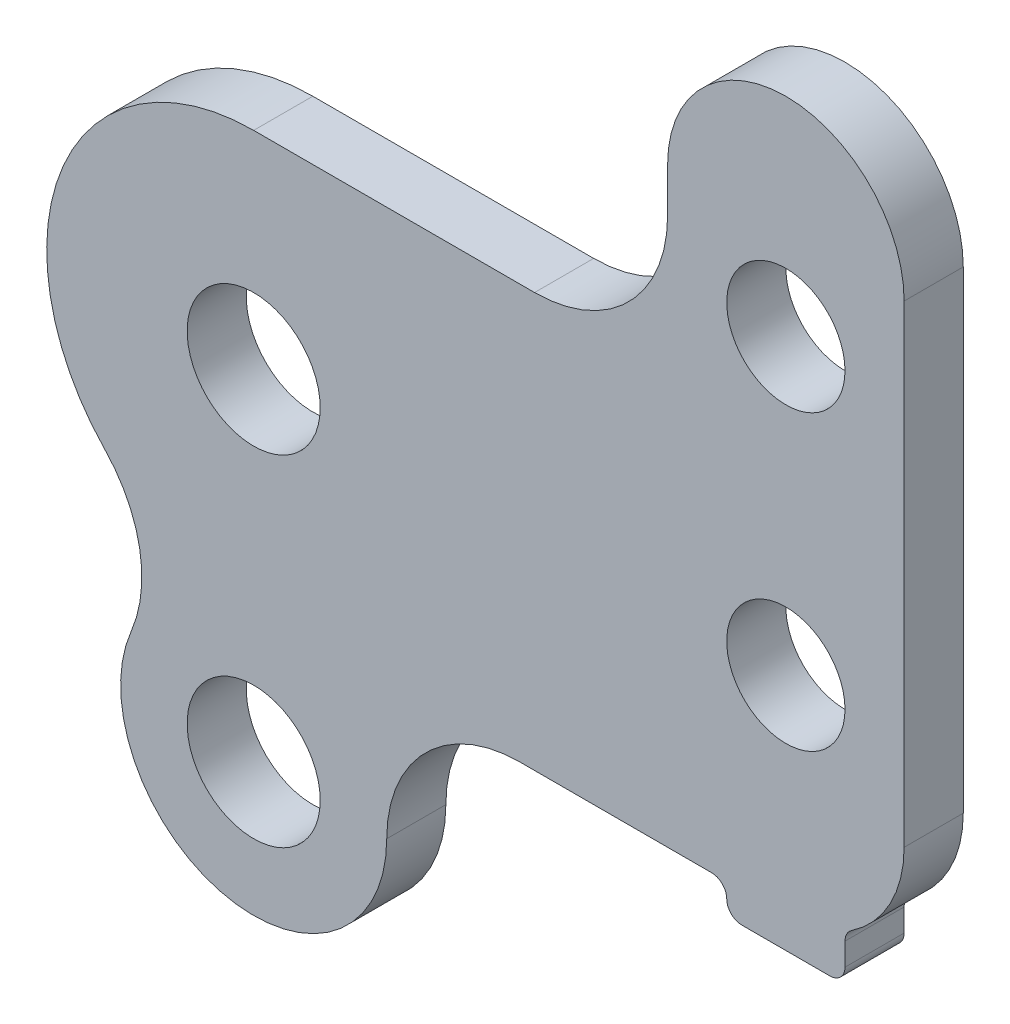
ISO-10303-21;
HEADER;
FILE_DESCRIPTION(('STEP AP214'),'2;1');
FILE_NAME('part.step','',(''),(''),'','','');
FILE_SCHEMA(('AUTOMOTIVE_DESIGN { 1 0 10303 214 1 1 1 1 }'));
ENDSEC;
DATA;
#1=APPLICATION_CONTEXT('core data for automotive mechanical design processes');
#2=APPLICATION_PROTOCOL_DEFINITION('international standard','automotive_design',2000,#1);
#3=PRODUCT_CONTEXT('',#1,'mechanical');
#4=PRODUCT('Part','Part','',(#3));
#5=PRODUCT_RELATED_PRODUCT_CATEGORY('part','',(#4));
#6=PRODUCT_DEFINITION_FORMATION('','',#4);
#7=PRODUCT_DEFINITION_CONTEXT('part definition',#1,'design');
#8=PRODUCT_DEFINITION('design','',#6,#7);
#9=PRODUCT_DEFINITION_SHAPE('','',#8);
#10=(LENGTH_UNIT() NAMED_UNIT(*) SI_UNIT(.MILLI.,.METRE.));
#11=(NAMED_UNIT(*) PLANE_ANGLE_UNIT() SI_UNIT($,.RADIAN.));
#12=(NAMED_UNIT(*) SI_UNIT($,.STERADIAN.) SOLID_ANGLE_UNIT());
#13=UNCERTAINTY_MEASURE_WITH_UNIT(LENGTH_MEASURE(1.E-05),#10,'distance_accuracy_value','');
#14=(GEOMETRIC_REPRESENTATION_CONTEXT(3) GLOBAL_UNCERTAINTY_ASSIGNED_CONTEXT((#13)) GLOBAL_UNIT_ASSIGNED_CONTEXT((#10,
#11,#12)) REPRESENTATION_CONTEXT('',''));
#15=CARTESIAN_POINT('',(0.,0.,0.));
#16=DIRECTION('',(0.,0.,1.));
#17=DIRECTION('',(1.,0.,0.));
#18=AXIS2_PLACEMENT_3D('',#15,#16,#17);
#19=CARTESIAN_POINT('',(0.,-6.36905,1.5875));
#20=DIRECTION('',(0.,1.,0.));
#21=DIRECTION('',(0.,0.,1.));
#22=AXIS2_PLACEMENT_3D('',#19,#20,#21);
#23=PLANE('',#22);
#24=DIRECTION('',(1.,0.,0.));
#25=VECTOR('',#24,1.);
#26=CARTESIAN_POINT('',(0.,-6.36905,0.));
#27=LINE('',#26,#25);
#28=CARTESIAN_POINT('',(13.1063647221787,-6.36905,0.));
#29=VERTEX_POINT('',#28);
#30=CARTESIAN_POINT('',(15.4685647221787,-6.36905,0.));
#31=VERTEX_POINT('',#30);
#32=EDGE_CURVE('E297',#29,#31,#27,.T.);
#33=ORIENTED_EDGE('',*,*,#32,.T.);
#34=DIRECTION('',(0.,0.,-1.));
#35=VECTOR('',#34,1.);
#36=CARTESIAN_POINT('',(15.4685647221787,-6.36905,1.5875));
#37=LINE('',#36,#35);
#38=CARTESIAN_POINT('',(15.4685647221787,-6.36905,1.5875));
#39=VERTEX_POINT('',#38);
#40=EDGE_CURVE('E338',#31,#39,#37,.F.);
#41=ORIENTED_EDGE('',*,*,#40,.T.);
#42=DIRECTION('',(1.,0.,0.));
#43=VECTOR('',#42,1.);
#44=CARTESIAN_POINT('',(0.,-6.36905,1.5875));
#45=LINE('',#44,#43);
#46=CARTESIAN_POINT('',(13.1063647221787,-6.36905,1.5875));
#47=VERTEX_POINT('',#46);
#48=EDGE_CURVE('E255',#47,#39,#45,.T.);
#49=ORIENTED_EDGE('',*,*,#48,.F.);
#50=DIRECTION('',(0.,0.,-1.));
#51=VECTOR('',#50,1.);
#52=CARTESIAN_POINT('',(13.1063647221787,-6.36905,1.5875));
#53=LINE('',#52,#51);
#54=EDGE_CURVE('E336',#47,#29,#53,.T.);
#55=ORIENTED_EDGE('',*,*,#54,.T.);
#56=EDGE_LOOP('',(#33,#41,#49,#55));
#57=FACE_BOUND('',#56,.T.);
#58=ADVANCED_FACE('F86',(#57),#23,.F.);
#59=CARTESIAN_POINT('',(0.,-9.128125,1.5875));
#60=DIRECTION('',(0.,0.,-1.));
#61=DIRECTION('',(-1.,0.,0.));
#62=AXIS2_PLACEMENT_3D('',#59,#60,#61);
#63=CYLINDRICAL_SURFACE('',#62,1.7859375);
#64=CARTESIAN_POINT('',(0.,-9.128125,1.5875));
#65=DIRECTION('',(0.,0.,1.));
#66=DIRECTION('',(1.,0.,0.));
#67=AXIS2_PLACEMENT_3D('',#64,#65,#66);
#68=CIRCLE('',#67,1.7859375);
#69=CARTESIAN_POINT('',(1.7859375,-9.128125,1.5875));
#70=VERTEX_POINT('',#69);
#71=EDGE_CURVE('E266',#70,#70,#68,.T.);
#72=ORIENTED_EDGE('',*,*,#71,.T.);
#73=EDGE_LOOP('',(#72));
#74=FACE_BOUND('',#73,.T.);
#75=CARTESIAN_POINT('',(0.,-9.128125,0.));
#76=DIRECTION('',(0.,0.,1.));
#77=DIRECTION('',(1.,0.,0.));
#78=AXIS2_PLACEMENT_3D('',#75,#76,#77);
#79=CIRCLE('',#78,1.7859375);
#80=CARTESIAN_POINT('',(1.7859375,-9.128125,0.));
#81=VERTEX_POINT('',#80);
#82=EDGE_CURVE('E309',#81,#81,#79,.T.);
#83=ORIENTED_EDGE('',*,*,#82,.F.);
#84=EDGE_LOOP('',(#83));
#85=FACE_BOUND('',#84,.T.);
#86=ADVANCED_FACE('F384',(#74,#85),#63,.F.);
#87=CARTESIAN_POINT('',(0.,0.,1.5875));
#88=DIRECTION('',(0.,0.,-1.));
#89=DIRECTION('',(-1.,0.,0.));
#90=AXIS2_PLACEMENT_3D('',#87,#88,#89);
#91=CYLINDRICAL_SURFACE('',#90,1.7859375);
#92=CARTESIAN_POINT('',(0.,0.,1.5875));
#93=DIRECTION('',(0.,0.,1.));
#94=DIRECTION('',(1.,0.,0.));
#95=AXIS2_PLACEMENT_3D('',#92,#93,#94);
#96=CIRCLE('',#95,1.7859375);
#97=CARTESIAN_POINT('',(1.7859375,0.,1.5875));
#98=VERTEX_POINT('',#97);
#99=EDGE_CURVE('E263',#98,#98,#96,.T.);
#100=ORIENTED_EDGE('',*,*,#99,.T.);
#101=EDGE_LOOP('',(#100));
#102=FACE_BOUND('',#101,.T.);
#103=CARTESIAN_POINT('',(0.,0.,0.));
#104=DIRECTION('',(0.,0.,1.));
#105=DIRECTION('',(1.,0.,0.));
#106=AXIS2_PLACEMENT_3D('',#103,#104,#105);
#107=CIRCLE('',#106,1.7859375);
#108=CARTESIAN_POINT('',(1.7859375,0.,0.));
#109=VERTEX_POINT('',#108);
#110=EDGE_CURVE('E306',#109,#109,#107,.T.);
#111=ORIENTED_EDGE('',*,*,#110,.F.);
#112=EDGE_LOOP('',(#111));
#113=FACE_BOUND('',#112,.T.);
#114=ADVANCED_FACE('F386',(#102,#113),#91,.F.);
#115=CARTESIAN_POINT('',(14.2874647221787,7.90575,1.5875));
#116=DIRECTION('',(0.,0.,-1.));
#117=DIRECTION('',(-1.,0.,0.));
#118=AXIS2_PLACEMENT_3D('',#115,#116,#117);
#119=CYLINDRICAL_SURFACE('',#118,1.58750000000001);
#120=CARTESIAN_POINT('',(14.2874647221787,7.90575,1.5875));
#121=DIRECTION('',(0.,0.,1.));
#122=DIRECTION('',(1.,0.,0.));
#123=AXIS2_PLACEMENT_3D('',#120,#121,#122);
#124=CIRCLE('',#123,1.58750000000001);
#125=CARTESIAN_POINT('',(15.8749647221787,7.90575,1.5875));
#126=VERTEX_POINT('',#125);
#127=EDGE_CURVE('E260',#126,#126,#124,.T.);
#128=ORIENTED_EDGE('',*,*,#127,.T.);
#129=EDGE_LOOP('',(#128));
#130=FACE_BOUND('',#129,.T.);
#131=CARTESIAN_POINT('',(14.2874647221787,7.90575,0.));
#132=DIRECTION('',(0.,0.,1.));
#133=DIRECTION('',(1.,0.,0.));
#134=AXIS2_PLACEMENT_3D('',#131,#132,#133);
#135=CIRCLE('',#134,1.58750000000001);
#136=CARTESIAN_POINT('',(15.8749647221787,7.90575,0.));
#137=VERTEX_POINT('',#136);
#138=EDGE_CURVE('E303',#137,#137,#135,.T.);
#139=ORIENTED_EDGE('',*,*,#138,.F.);
#140=EDGE_LOOP('',(#139));
#141=FACE_BOUND('',#140,.T.);
#142=ADVANCED_FACE('F393',(#130,#141),#119,.F.);
#143=CARTESIAN_POINT('',(14.2874647221787,0.0317500000000005,1.5875));
#144=DIRECTION('',(0.,0.,-1.));
#145=DIRECTION('',(-1.,0.,0.));
#146=AXIS2_PLACEMENT_3D('',#143,#144,#145);
#147=CYLINDRICAL_SURFACE('',#146,1.58750000000001);
#148=CARTESIAN_POINT('',(14.2874647221787,0.0317500000000005,1.5875));
#149=DIRECTION('',(0.,0.,1.));
#150=DIRECTION('',(1.,0.,0.));
#151=AXIS2_PLACEMENT_3D('',#148,#149,#150);
#152=CIRCLE('',#151,1.58750000000001);
#153=CARTESIAN_POINT('',(15.8749647221787,0.0317500000000005,1.5875));
#154=VERTEX_POINT('',#153);
#155=EDGE_CURVE('E257',#154,#154,#152,.T.);
#156=ORIENTED_EDGE('',*,*,#155,.T.);
#157=EDGE_LOOP('',(#156));
#158=FACE_BOUND('',#157,.T.);
#159=CARTESIAN_POINT('',(14.2874647221787,0.0317500000000005,0.));
#160=DIRECTION('',(0.,0.,1.));
#161=DIRECTION('',(1.,0.,0.));
#162=AXIS2_PLACEMENT_3D('',#159,#160,#161);
#163=CIRCLE('',#162,1.58750000000001);
#164=CARTESIAN_POINT('',(15.8749647221787,0.0317500000000005,0.));
#165=VERTEX_POINT('',#164);
#166=EDGE_CURVE('E300',#165,#165,#163,.T.);
#167=ORIENTED_EDGE('',*,*,#166,.F.);
#168=EDGE_LOOP('',(#167));
#169=FACE_BOUND('',#168,.T.);
#170=ADVANCED_FACE('F405',(#158,#169),#147,.F.);
#171=CARTESIAN_POINT('',(14.2874647221787,-2.38125,1.5875));
#172=DIRECTION('',(0.,0.,-1.));
#173=DIRECTION('',(-1.,0.,0.));
#174=AXIS2_PLACEMENT_3D('',#171,#172,#173);
#175=CYLINDRICAL_SURFACE('',#174,3.17500000000001);
#176=CARTESIAN_POINT('',(14.2874647221787,-2.38125,1.5875));
#177=DIRECTION('',(0.,0.,1.));
#178=DIRECTION('',(1.,0.,0.));
#179=AXIS2_PLACEMENT_3D('',#176,#177,#178);
#180=CIRCLE('',#179,3.17500000000001);
#181=CARTESIAN_POINT('',(16.0551065661503,-5.01868574546199,1.5875));
#182=VERTEX_POINT('',#181);
#183=CARTESIAN_POINT('',(17.4624647221787,-2.38125,1.5875));
#184=VERTEX_POINT('',#183);
#185=EDGE_CURVE('E205',#182,#184,#180,.T.);
#186=ORIENTED_EDGE('',*,*,#185,.F.);
#187=DIRECTION('',(0.,0.,-1.));
#188=VECTOR('',#187,1.);
#189=CARTESIAN_POINT('',(16.0551065661503,-5.01868574546199,1.5875));
#190=LINE('',#189,#188);
#191=CARTESIAN_POINT('',(16.0551065661503,-5.01868574546199,0.));
#192=VERTEX_POINT('',#191);
#193=EDGE_CURVE('E228',#182,#192,#190,.T.);
#194=ORIENTED_EDGE('',*,*,#193,.T.);
#195=CARTESIAN_POINT('',(14.2874647221787,-2.38125,0.));
#196=DIRECTION('',(0.,0.,1.));
#197=DIRECTION('',(1.,0.,0.));
#198=AXIS2_PLACEMENT_3D('',#195,#196,#197);
#199=CIRCLE('',#198,3.17500000000001);
#200=CARTESIAN_POINT('',(17.4624647221787,-2.38125,0.));
#201=VERTEX_POINT('',#200);
#202=EDGE_CURVE('E224',#192,#201,#199,.T.);
#203=ORIENTED_EDGE('',*,*,#202,.T.);
#204=DIRECTION('',(0.,0.,-1.));
#205=VECTOR('',#204,1.);
#206=CARTESIAN_POINT('',(17.4624647221787,-2.38125,1.5875));
#207=LINE('',#206,#205);
#208=EDGE_CURVE('E221',#184,#201,#207,.T.);
#209=ORIENTED_EDGE('',*,*,#208,.F.);
#210=EDGE_LOOP('',(#186,#194,#203,#209));
#211=FACE_BOUND('',#210,.T.);
#212=ADVANCED_FACE('F222',(#211),#175,.T.);
#213=CARTESIAN_POINT('',(17.4624647221787,0.,1.5875));
#214=DIRECTION('',(1.,0.,0.));
#215=DIRECTION('',(0.,0.,-1.));
#216=AXIS2_PLACEMENT_3D('',#213,#214,#215);
#217=PLANE('',#216);
#218=DIRECTION('',(0.,-1.,0.));
#219=VECTOR('',#218,1.);
#220=CARTESIAN_POINT('',(17.4624647221787,0.,0.));
#221=LINE('',#220,#219);
#222=CARTESIAN_POINT('',(17.4624647221787,10.31875,0.));
#223=VERTEX_POINT('',#222);
#224=EDGE_CURVE('E275',#223,#201,#221,.T.);
#225=ORIENTED_EDGE('',*,*,#224,.F.);
#226=DIRECTION('',(0.,0.,-1.));
#227=VECTOR('',#226,1.);
#228=CARTESIAN_POINT('',(17.4624647221787,10.31875,1.5875));
#229=LINE('',#228,#227);
#230=CARTESIAN_POINT('',(17.4624647221787,10.31875,1.5875));
#231=VERTEX_POINT('',#230);
#232=EDGE_CURVE('E229',#231,#223,#229,.T.);
#233=ORIENTED_EDGE('',*,*,#232,.F.);
#234=DIRECTION('',(0.,-1.,0.));
#235=VECTOR('',#234,1.);
#236=CARTESIAN_POINT('',(17.4624647221787,0.,1.5875));
#237=LINE('',#236,#235);
#238=EDGE_CURVE('E211',#231,#184,#237,.T.);
#239=ORIENTED_EDGE('',*,*,#238,.T.);
#240=ORIENTED_EDGE('',*,*,#208,.T.);
#241=EDGE_LOOP('',(#225,#233,#239,#240));
#242=FACE_BOUND('',#241,.T.);
#243=ADVANCED_FACE('F231',(#242),#217,.T.);
#244=CARTESIAN_POINT('',(14.2874647221787,10.31875,1.5875));
#245=DIRECTION('',(0.,0.,-1.));
#246=DIRECTION('',(-1.,0.,0.));
#247=AXIS2_PLACEMENT_3D('',#244,#245,#246);
#248=CYLINDRICAL_SURFACE('',#247,3.17500000000001);
#249=CARTESIAN_POINT('',(14.2874647221787,10.31875,0.));
#250=DIRECTION('',(0.,0.,1.));
#251=DIRECTION('',(1.,0.,0.));
#252=AXIS2_PLACEMENT_3D('',#249,#250,#251);
#253=CIRCLE('',#252,3.17500000000001);
#254=CARTESIAN_POINT('',(11.1124647221787,10.31875,0.));
#255=VERTEX_POINT('',#254);
#256=EDGE_CURVE('E277',#223,#255,#253,.T.);
#257=ORIENTED_EDGE('',*,*,#256,.T.);
#258=DIRECTION('',(0.,0.,-1.));
#259=VECTOR('',#258,1.);
#260=CARTESIAN_POINT('',(11.1124647221787,10.31875,1.5875));
#261=LINE('',#260,#259);
#262=CARTESIAN_POINT('',(11.1124647221787,10.31875,1.5875));
#263=VERTEX_POINT('',#262);
#264=EDGE_CURVE('E322',#263,#255,#261,.T.);
#265=ORIENTED_EDGE('',*,*,#264,.F.);
#266=CARTESIAN_POINT('',(14.2874647221787,10.31875,1.5875));
#267=DIRECTION('',(0.,0.,1.));
#268=DIRECTION('',(1.,0.,0.));
#269=AXIS2_PLACEMENT_3D('',#266,#267,#268);
#270=CIRCLE('',#269,3.17500000000001);
#271=EDGE_CURVE('E233',#231,#263,#270,.T.);
#272=ORIENTED_EDGE('',*,*,#271,.F.);
#273=ORIENTED_EDGE('',*,*,#232,.T.);
#274=EDGE_LOOP('',(#257,#265,#272,#273));
#275=FACE_BOUND('',#274,.T.);
#276=ADVANCED_FACE('F434',(#275),#248,.T.);
#277=CARTESIAN_POINT('',(11.1124647221787,0.,1.5875));
#278=DIRECTION('',(1.,0.,0.));
#279=DIRECTION('',(0.,1.,0.));
#280=AXIS2_PLACEMENT_3D('',#277,#278,#279);
#281=PLANE('',#280);
#282=DIRECTION('',(0.,-1.,0.));
#283=VECTOR('',#282,1.);
#284=CARTESIAN_POINT('',(11.1124647221787,0.,0.));
#285=LINE('',#284,#283);
#286=CARTESIAN_POINT('',(11.1124647221787,9.128125,0.));
#287=VERTEX_POINT('',#286);
#288=EDGE_CURVE('E279',#255,#287,#285,.T.);
#289=ORIENTED_EDGE('',*,*,#288,.T.);
#290=DIRECTION('',(0.,0.,-1.));
#291=VECTOR('',#290,1.);
#292=CARTESIAN_POINT('',(11.1124647221787,9.128125,1.5875));
#293=LINE('',#292,#291);
#294=CARTESIAN_POINT('',(11.1124647221787,9.128125,1.5875));
#295=VERTEX_POINT('',#294);
#296=EDGE_CURVE('E101',#287,#295,#293,.F.);
#297=ORIENTED_EDGE('',*,*,#296,.T.);
#298=DIRECTION('',(0.,-1.,0.));
#299=VECTOR('',#298,1.);
#300=CARTESIAN_POINT('',(11.1124647221787,0.,1.5875));
#301=LINE('',#300,#299);
#302=EDGE_CURVE('E235',#263,#295,#301,.T.);
#303=ORIENTED_EDGE('',*,*,#302,.F.);
#304=ORIENTED_EDGE('',*,*,#264,.T.);
#305=EDGE_LOOP('',(#289,#297,#303,#304));
#306=FACE_BOUND('',#305,.T.);
#307=ADVANCED_FACE('F431',(#306),#281,.F.);
#308=CARTESIAN_POINT('',(0.,5.55625,1.5875));
#309=DIRECTION('',(0.,1.,0.));
#310=DIRECTION('',(-1.,0.,0.));
#311=AXIS2_PLACEMENT_3D('',#308,#309,#310);
#312=PLANE('',#311);
#313=DIRECTION('',(1.,0.,0.));
#314=VECTOR('',#313,1.);
#315=CARTESIAN_POINT('',(0.,5.55625,1.5875));
#316=LINE('',#315,#314);
#317=CARTESIAN_POINT('',(0.,5.55625,1.5875));
#318=VERTEX_POINT('',#317);
#319=CARTESIAN_POINT('',(7.54058972217867,5.55625,1.5875));
#320=VERTEX_POINT('',#319);
#321=EDGE_CURVE('E240',#318,#320,#316,.T.);
#322=ORIENTED_EDGE('',*,*,#321,.T.);
#323=DIRECTION('',(0.,0.,-1.));
#324=VECTOR('',#323,1.);
#325=CARTESIAN_POINT('',(7.54058972217867,5.55625,1.5875));
#326=LINE('',#325,#324);
#327=CARTESIAN_POINT('',(7.54058972217867,5.55625,0.));
#328=VERTEX_POINT('',#327);
#329=EDGE_CURVE('E354',#320,#328,#326,.T.);
#330=ORIENTED_EDGE('',*,*,#329,.T.);
#331=DIRECTION('',(1.,0.,0.));
#332=VECTOR('',#331,1.);
#333=CARTESIAN_POINT('',(0.,5.55625,0.));
#334=LINE('',#333,#332);
#335=CARTESIAN_POINT('',(0.,5.55625,0.));
#336=VERTEX_POINT('',#335);
#337=EDGE_CURVE('E281',#336,#328,#334,.T.);
#338=ORIENTED_EDGE('',*,*,#337,.F.);
#339=DIRECTION('',(0.,0.,-1.));
#340=VECTOR('',#339,1.);
#341=CARTESIAN_POINT('',(0.,5.55625,1.5875));
#342=LINE('',#341,#340);
#343=EDGE_CURVE('E320',#318,#336,#342,.T.);
#344=ORIENTED_EDGE('',*,*,#343,.F.);
#345=EDGE_LOOP('',(#322,#330,#338,#344));
#346=FACE_BOUND('',#345,.T.);
#347=ADVANCED_FACE('F362',(#346),#312,.T.);
#348=CARTESIAN_POINT('',(0.,0.,1.5875));
#349=DIRECTION('',(0.,0.,-1.));
#350=DIRECTION('',(-1.,0.,0.));
#351=AXIS2_PLACEMENT_3D('',#348,#349,#350);
#352=CYLINDRICAL_SURFACE('',#351,5.55625);
#353=CARTESIAN_POINT('',(0.,0.,0.));
#354=DIRECTION('',(0.,0.,1.));
#355=DIRECTION('',(1.,0.,0.));
#356=AXIS2_PLACEMENT_3D('',#353,#354,#355);
#357=CIRCLE('',#356,5.55625);
#358=CARTESIAN_POINT('',(-4.0016363402321,-3.8547140831758,0.));
#359=VERTEX_POINT('',#358);
#360=EDGE_CURVE('E283',#336,#359,#357,.T.);
#361=ORIENTED_EDGE('',*,*,#360,.T.);
#362=DIRECTION('',(0.,0.,-1.));
#363=VECTOR('',#362,1.);
#364=CARTESIAN_POINT('',(-4.0016363402321,-3.8547140831758,1.5875));
#365=LINE('',#364,#363);
#366=CARTESIAN_POINT('',(-4.0016363402321,-3.8547140831758,1.5875));
#367=VERTEX_POINT('',#366);
#368=EDGE_CURVE('E318',#367,#359,#365,.T.);
#369=ORIENTED_EDGE('',*,*,#368,.F.);
#370=CARTESIAN_POINT('',(0.,0.,1.5875));
#371=DIRECTION('',(0.,0.,1.));
#372=DIRECTION('',(1.,0.,0.));
#373=AXIS2_PLACEMENT_3D('',#370,#371,#372);
#374=CIRCLE('',#373,5.55625);
#375=EDGE_CURVE('E243',#318,#367,#374,.T.);
#376=ORIENTED_EDGE('',*,*,#375,.F.);
#377=ORIENTED_EDGE('',*,*,#343,.T.);
#378=EDGE_LOOP('',(#361,#369,#376,#377));
#379=FACE_BOUND('',#378,.T.);
#380=ADVANCED_FACE('F373',(#379),#352,.T.);
#381=CARTESIAN_POINT('',(-6.57411684466701,-6.33274456521739,1.5875));
#382=DIRECTION('',(0.,0.,-1.));
#383=DIRECTION('',(-1.,0.,0.));
#384=AXIS2_PLACEMENT_3D('',#381,#382,#383);
#385=CYLINDRICAL_SURFACE('',#384,3.571875);
#386=CARTESIAN_POINT('',(-6.57411684466701,-6.33274456521739,0.));
#387=DIRECTION('',(0.,0.,1.));
#388=DIRECTION('',(1.,0.,0.));
#389=AXIS2_PLACEMENT_3D('',#386,#387,#388);
#390=CIRCLE('',#389,3.571875);
#391=CARTESIAN_POINT('',(-3.28705842233351,-7.73043478260869,0.));
#392=VERTEX_POINT('',#391);
#393=EDGE_CURVE('E286',#392,#359,#390,.T.);
#394=ORIENTED_EDGE('',*,*,#393,.F.);
#395=DIRECTION('',(0.,0.,-1.));
#396=VECTOR('',#395,1.);
#397=CARTESIAN_POINT('',(-3.28705842233351,-7.73043478260869,1.5875));
#398=LINE('',#397,#396);
#399=CARTESIAN_POINT('',(-3.28705842233351,-7.73043478260869,1.5875));
#400=VERTEX_POINT('',#399);
#401=EDGE_CURVE('E316',#400,#392,#398,.T.);
#402=ORIENTED_EDGE('',*,*,#401,.F.);
#403=CARTESIAN_POINT('',(-6.57411684466701,-6.33274456521739,1.5875));
#404=DIRECTION('',(0.,0.,1.));
#405=DIRECTION('',(1.,0.,0.));
#406=AXIS2_PLACEMENT_3D('',#403,#404,#405);
#407=CIRCLE('',#406,3.571875);
#408=EDGE_CURVE('E245',#400,#367,#407,.T.);
#409=ORIENTED_EDGE('',*,*,#408,.T.);
#410=ORIENTED_EDGE('',*,*,#368,.T.);
#411=EDGE_LOOP('',(#394,#402,#409,#410));
#412=FACE_BOUND('',#411,.T.);
#413=ADVANCED_FACE('F422',(#412),#385,.F.);
#414=CARTESIAN_POINT('',(0.,-9.128125,1.5875));
#415=DIRECTION('',(0.,0.,-1.));
#416=DIRECTION('',(-1.,0.,0.));
#417=AXIS2_PLACEMENT_3D('',#414,#415,#416);
#418=CYLINDRICAL_SURFACE('',#417,3.571875);
#419=CARTESIAN_POINT('',(0.,-9.128125,0.));
#420=DIRECTION('',(0.,0.,1.));
#421=DIRECTION('',(1.,0.,0.));
#422=AXIS2_PLACEMENT_3D('',#419,#420,#421);
#423=CIRCLE('',#422,3.571875);
#424=CARTESIAN_POINT('',(3.571875,-9.128125,0.));
#425=VERTEX_POINT('',#424);
#426=EDGE_CURVE('E289',#392,#425,#423,.T.);
#427=ORIENTED_EDGE('',*,*,#426,.T.);
#428=DIRECTION('',(0.,0.,-1.));
#429=VECTOR('',#428,1.);
#430=CARTESIAN_POINT('',(3.571875,-9.128125,1.5875));
#431=LINE('',#430,#429);
#432=CARTESIAN_POINT('',(3.571875,-9.128125,1.5875));
#433=VERTEX_POINT('',#432);
#434=EDGE_CURVE('E314',#433,#425,#431,.T.);
#435=ORIENTED_EDGE('',*,*,#434,.F.);
#436=CARTESIAN_POINT('',(0.,-9.128125,1.5875));
#437=DIRECTION('',(0.,0.,1.));
#438=DIRECTION('',(1.,0.,0.));
#439=AXIS2_PLACEMENT_3D('',#436,#437,#438);
#440=CIRCLE('',#439,3.571875);
#441=EDGE_CURVE('E248',#400,#433,#440,.T.);
#442=ORIENTED_EDGE('',*,*,#441,.F.);
#443=ORIENTED_EDGE('',*,*,#401,.T.);
#444=EDGE_LOOP('',(#427,#435,#442,#443));
#445=FACE_BOUND('',#444,.T.);
#446=ADVANCED_FACE('F418',(#445),#418,.T.);
#447=CARTESIAN_POINT('',(7.14375,-9.128125,1.5875));
#448=DIRECTION('',(0.,0.,-1.));
#449=DIRECTION('',(-1.,0.,0.));
#450=AXIS2_PLACEMENT_3D('',#447,#448,#449);
#451=CYLINDRICAL_SURFACE('',#450,3.571875);
#452=CARTESIAN_POINT('',(7.14375,-9.128125,0.));
#453=DIRECTION('',(0.,0.,1.));
#454=DIRECTION('',(1.,0.,0.));
#455=AXIS2_PLACEMENT_3D('',#452,#453,#454);
#456=CIRCLE('',#455,3.571875);
#457=CARTESIAN_POINT('',(7.14375,-5.55625,0.));
#458=VERTEX_POINT('',#457);
#459=EDGE_CURVE('E292',#458,#425,#456,.T.);
#460=ORIENTED_EDGE('',*,*,#459,.F.);
#461=DIRECTION('',(0.,0.,-1.));
#462=VECTOR('',#461,1.);
#463=CARTESIAN_POINT('',(7.14375,-5.55625,1.5875));
#464=LINE('',#463,#462);
#465=CARTESIAN_POINT('',(7.14375,-5.55625,1.5875));
#466=VERTEX_POINT('',#465);
#467=EDGE_CURVE('E269',#466,#458,#464,.T.);
#468=ORIENTED_EDGE('',*,*,#467,.F.);
#469=CARTESIAN_POINT('',(7.14375,-9.128125,1.5875));
#470=DIRECTION('',(0.,0.,1.));
#471=DIRECTION('',(1.,0.,0.));
#472=AXIS2_PLACEMENT_3D('',#469,#470,#471);
#473=CIRCLE('',#472,3.571875);
#474=EDGE_CURVE('E250',#466,#433,#473,.T.);
#475=ORIENTED_EDGE('',*,*,#474,.T.);
#476=ORIENTED_EDGE('',*,*,#434,.T.);
#477=EDGE_LOOP('',(#460,#468,#475,#476));
#478=FACE_BOUND('',#477,.T.);
#479=ADVANCED_FACE('F414',(#478),#451,.F.);
#480=CARTESIAN_POINT('',(0.,-5.55625,1.5875));
#481=DIRECTION('',(0.,-1.,0.));
#482=DIRECTION('',(0.,0.,-1.));
#483=AXIS2_PLACEMENT_3D('',#480,#481,#482);
#484=PLANE('',#483);
#485=DIRECTION('',(-1.,0.,0.));
#486=VECTOR('',#485,1.);
#487=CARTESIAN_POINT('',(0.,-5.55625,0.));
#488=LINE('',#487,#486);
#489=CARTESIAN_POINT('',(12.2935647221787,-5.55625,0.));
#490=VERTEX_POINT('',#489);
#491=EDGE_CURVE('E295',#490,#458,#488,.T.);
#492=ORIENTED_EDGE('',*,*,#491,.F.);
#493=DIRECTION('',(0.,0.,-1.));
#494=VECTOR('',#493,1.);
#495=CARTESIAN_POINT('',(12.2935647221787,-5.55625,1.5875));
#496=LINE('',#495,#494);
#497=CARTESIAN_POINT('',(12.2935647221787,-5.55625,1.5875));
#498=VERTEX_POINT('',#497);
#499=EDGE_CURVE('E344',#490,#498,#496,.F.);
#500=ORIENTED_EDGE('',*,*,#499,.T.);
#501=DIRECTION('',(-1.,0.,0.));
#502=VECTOR('',#501,1.);
#503=CARTESIAN_POINT('',(0.,-5.55625,1.5875));
#504=LINE('',#503,#502);
#505=EDGE_CURVE('E253',#498,#466,#504,.T.);
#506=ORIENTED_EDGE('',*,*,#505,.T.);
#507=ORIENTED_EDGE('',*,*,#467,.T.);
#508=EDGE_LOOP('',(#492,#500,#506,#507));
#509=FACE_BOUND('',#508,.T.);
#510=ADVANCED_FACE('F410',(#509),#484,.T.);
#511=CARTESIAN_POINT('',(15.8749647221786,0.,1.5875));
#512=DIRECTION('',(1.,0.,0.));
#513=DIRECTION('',(0.,1.,0.));
#514=AXIS2_PLACEMENT_3D('',#511,#512,#513);
#515=PLANE('',#514);
#516=DIRECTION('',(0.,-1.,0.));
#517=VECTOR('',#516,1.);
#518=CARTESIAN_POINT('',(15.8749647221786,0.,0.));
#519=LINE('',#518,#517);
#520=CARTESIAN_POINT('',(15.8749647221787,-5.35627752088112,0.));
#521=VERTEX_POINT('',#520);
#522=CARTESIAN_POINT('',(15.8749647221787,-5.96265,0.));
#523=VERTEX_POINT('',#522);
#524=EDGE_CURVE('E270',#521,#523,#519,.T.);
#525=ORIENTED_EDGE('',*,*,#524,.F.);
#526=DIRECTION('',(0.,0.,-1.));
#527=VECTOR('',#526,1.);
#528=CARTESIAN_POINT('',(15.8749647221787,-5.35627752088112,1.5875));
#529=LINE('',#528,#527);
#530=CARTESIAN_POINT('',(15.8749647221787,-5.35627752088112,1.5875));
#531=VERTEX_POINT('',#530);
#532=EDGE_CURVE('E330',#521,#531,#529,.F.);
#533=ORIENTED_EDGE('',*,*,#532,.T.);
#534=DIRECTION('',(0.,-1.,0.));
#535=VECTOR('',#534,1.);
#536=CARTESIAN_POINT('',(15.8749647221786,0.,1.5875));
#537=LINE('',#536,#535);
#538=CARTESIAN_POINT('',(15.8749647221787,-5.96265,1.5875));
#539=VERTEX_POINT('',#538);
#540=EDGE_CURVE('E218',#531,#539,#537,.T.);
#541=ORIENTED_EDGE('',*,*,#540,.T.);
#542=DIRECTION('',(0.,0.,-1.));
#543=VECTOR('',#542,1.);
#544=CARTESIAN_POINT('',(15.8749647221787,-5.96265,0.));
#545=LINE('',#544,#543);
#546=EDGE_CURVE('E327',#539,#523,#545,.T.);
#547=ORIENTED_EDGE('',*,*,#546,.T.);
#548=EDGE_LOOP('',(#525,#533,#541,#547));
#549=FACE_BOUND('',#548,.T.);
#550=ADVANCED_FACE('F413',(#549),#515,.T.);
#551=CARTESIAN_POINT('',(0.,0.,0.));
#552=DIRECTION('',(0.,0.,1.));
#553=DIRECTION('',(1.,0.,0.));
#554=AXIS2_PLACEMENT_3D('',#551,#552,#553);
#555=PLANE('',#554);
#556=ORIENTED_EDGE('',*,*,#524,.T.);
#557=CARTESIAN_POINT('',(15.4685647221787,-5.96265,0.));
#558=DIRECTION('',(0.,0.,1.));
#559=DIRECTION('',(1.,0.,0.));
#560=AXIS2_PLACEMENT_3D('',#557,#558,#559);
#561=CIRCLE('',#560,0.4064);
#562=EDGE_CURVE('E334',#523,#31,#561,.F.);
#563=ORIENTED_EDGE('',*,*,#562,.T.);
#564=ORIENTED_EDGE('',*,*,#32,.F.);
#565=CARTESIAN_POINT('',(13.1063647221787,-5.96265,0.));
#566=DIRECTION('',(0.,0.,1.));
#567=DIRECTION('',(1.,0.,0.));
#568=AXIS2_PLACEMENT_3D('',#565,#566,#567);
#569=CIRCLE('',#568,0.4064);
#570=CARTESIAN_POINT('',(12.6999647221787,-5.96265,0.));
#571=VERTEX_POINT('',#570);
#572=EDGE_CURVE('E332',#29,#571,#569,.F.);
#573=ORIENTED_EDGE('',*,*,#572,.T.);
#574=CARTESIAN_POINT('',(12.2935647221787,-5.96265,0.));
#575=DIRECTION('',(0.,0.,1.));
#576=DIRECTION('',(1.,0.,0.));
#577=AXIS2_PLACEMENT_3D('',#574,#575,#576);
#578=CIRCLE('',#577,0.4064);
#579=EDGE_CURVE('E350',#571,#490,#578,.T.);
#580=ORIENTED_EDGE('',*,*,#579,.T.);
#581=ORIENTED_EDGE('',*,*,#491,.T.);
#582=ORIENTED_EDGE('',*,*,#459,.T.);
#583=ORIENTED_EDGE('',*,*,#426,.F.);
#584=ORIENTED_EDGE('',*,*,#393,.T.);
#585=ORIENTED_EDGE('',*,*,#360,.F.);
#586=ORIENTED_EDGE('',*,*,#337,.T.);
#587=CARTESIAN_POINT('',(7.54058972217867,9.128125,0.));
#588=DIRECTION('',(0.,0.,1.));
#589=DIRECTION('',(1.,0.,0.));
#590=AXIS2_PLACEMENT_3D('',#587,#588,#589);
#591=CIRCLE('',#590,3.571875);
#592=EDGE_CURVE('E94',#328,#287,#591,.T.);
#593=ORIENTED_EDGE('',*,*,#592,.T.);
#594=ORIENTED_EDGE('',*,*,#288,.F.);
#595=ORIENTED_EDGE('',*,*,#256,.F.);
#596=ORIENTED_EDGE('',*,*,#224,.T.);
#597=ORIENTED_EDGE('',*,*,#202,.F.);
#598=CARTESIAN_POINT('',(16.2813647221787,-5.35627752088112,0.));
#599=DIRECTION('',(0.,0.,1.));
#600=DIRECTION('',(1.,0.,0.));
#601=AXIS2_PLACEMENT_3D('',#598,#599,#600);
#602=CIRCLE('',#601,0.4064);
#603=EDGE_CURVE('E347',#192,#521,#602,.T.);
#604=ORIENTED_EDGE('',*,*,#603,.T.);
#605=EDGE_LOOP('',(#556,#563,#564,#573,#580,#581,#582,#583,#584,#585,#586,#593,#594,#595,#596,
#597,#604));
#606=FACE_BOUND('',#605,.T.);
#607=ORIENTED_EDGE('',*,*,#166,.T.);
#608=EDGE_LOOP('',(#607));
#609=FACE_BOUND('',#608,.T.);
#610=ORIENTED_EDGE('',*,*,#138,.T.);
#611=EDGE_LOOP('',(#610));
#612=FACE_BOUND('',#611,.T.);
#613=ORIENTED_EDGE('',*,*,#110,.T.);
#614=EDGE_LOOP('',(#613));
#615=FACE_BOUND('',#614,.T.);
#616=ORIENTED_EDGE('',*,*,#82,.T.);
#617=EDGE_LOOP('',(#616));
#618=FACE_BOUND('',#617,.T.);
#619=ADVANCED_FACE('F367',(#606,#609,#612,#615,#618),#555,.F.);
#620=CARTESIAN_POINT('',(0.,0.,1.5875));
#621=DIRECTION('',(0.,0.,1.));
#622=DIRECTION('',(1.,0.,0.));
#623=AXIS2_PLACEMENT_3D('',#620,#621,#622);
#624=PLANE('',#623);
#625=ORIENTED_EDGE('',*,*,#48,.T.);
#626=CARTESIAN_POINT('',(15.4685647221787,-5.96265,1.5875));
#627=DIRECTION('',(0.,0.,1.));
#628=DIRECTION('',(1.,0.,0.));
#629=AXIS2_PLACEMENT_3D('',#626,#627,#628);
#630=CIRCLE('',#629,0.4064);
#631=EDGE_CURVE('E342',#39,#539,#630,.T.);
#632=ORIENTED_EDGE('',*,*,#631,.T.);
#633=ORIENTED_EDGE('',*,*,#540,.F.);
#634=CARTESIAN_POINT('',(16.2813647221787,-5.35627752088112,1.5875));
#635=DIRECTION('',(0.,0.,1.));
#636=DIRECTION('',(1.,0.,0.));
#637=AXIS2_PLACEMENT_3D('',#634,#635,#636);
#638=CIRCLE('',#637,0.4064);
#639=EDGE_CURVE('E214',#531,#182,#638,.F.);
#640=ORIENTED_EDGE('',*,*,#639,.T.);
#641=ORIENTED_EDGE('',*,*,#185,.T.);
#642=ORIENTED_EDGE('',*,*,#238,.F.);
#643=ORIENTED_EDGE('',*,*,#271,.T.);
#644=ORIENTED_EDGE('',*,*,#302,.T.);
#645=CARTESIAN_POINT('',(7.54058972217867,9.128125,1.5875));
#646=DIRECTION('',(0.,0.,1.));
#647=DIRECTION('',(1.,0.,0.));
#648=AXIS2_PLACEMENT_3D('',#645,#646,#647);
#649=CIRCLE('',#648,3.571875);
#650=EDGE_CURVE('E12',#295,#320,#649,.F.);
#651=ORIENTED_EDGE('',*,*,#650,.T.);
#652=ORIENTED_EDGE('',*,*,#321,.F.);
#653=ORIENTED_EDGE('',*,*,#375,.T.);
#654=ORIENTED_EDGE('',*,*,#408,.F.);
#655=ORIENTED_EDGE('',*,*,#441,.T.);
#656=ORIENTED_EDGE('',*,*,#474,.F.);
#657=ORIENTED_EDGE('',*,*,#505,.F.);
#658=CARTESIAN_POINT('',(12.2935647221787,-5.96265,1.5875));
#659=DIRECTION('',(0.,0.,1.));
#660=DIRECTION('',(1.,0.,0.));
#661=AXIS2_PLACEMENT_3D('',#658,#659,#660);
#662=CIRCLE('',#661,0.4064);
#663=CARTESIAN_POINT('',(12.6999647221787,-5.96265,1.5875));
#664=VERTEX_POINT('',#663);
#665=EDGE_CURVE('E352',#498,#664,#662,.F.);
#666=ORIENTED_EDGE('',*,*,#665,.T.);
#667=CARTESIAN_POINT('',(13.1063647221787,-5.96265,1.5875));
#668=DIRECTION('',(0.,0.,1.));
#669=DIRECTION('',(1.,0.,0.));
#670=AXIS2_PLACEMENT_3D('',#667,#668,#669);
#671=CIRCLE('',#670,0.4064);
#672=EDGE_CURVE('E340',#664,#47,#671,.T.);
#673=ORIENTED_EDGE('',*,*,#672,.T.);
#674=EDGE_LOOP('',(#625,#632,#633,#640,#641,#642,#643,#644,#651,#652,#653,#654,#655,#656,#657,
#666,#673));
#675=FACE_BOUND('',#674,.T.);
#676=ORIENTED_EDGE('',*,*,#155,.F.);
#677=EDGE_LOOP('',(#676));
#678=FACE_BOUND('',#677,.T.);
#679=ORIENTED_EDGE('',*,*,#127,.F.);
#680=EDGE_LOOP('',(#679));
#681=FACE_BOUND('',#680,.T.);
#682=ORIENTED_EDGE('',*,*,#99,.F.);
#683=EDGE_LOOP('',(#682));
#684=FACE_BOUND('',#683,.T.);
#685=ORIENTED_EDGE('',*,*,#71,.F.);
#686=EDGE_LOOP('',(#685));
#687=FACE_BOUND('',#686,.T.);
#688=ADVANCED_FACE('F208',(#675,#678,#681,#684,#687),#624,.T.);
#689=CARTESIAN_POINT('',(16.2813647221787,-5.35627752088112,1.5875));
#690=DIRECTION('',(0.,0.,-1.));
#691=DIRECTION('',(-1.,0.,0.));
#692=AXIS2_PLACEMENT_3D('',#689,#690,#691);
#693=CYLINDRICAL_SURFACE('',#692,0.4064);
#694=ORIENTED_EDGE('',*,*,#639,.F.);
#695=ORIENTED_EDGE('',*,*,#532,.F.);
#696=ORIENTED_EDGE('',*,*,#603,.F.);
#697=ORIENTED_EDGE('',*,*,#193,.F.);
#698=EDGE_LOOP('',(#694,#695,#696,#697));
#699=FACE_BOUND('',#698,.T.);
#700=ADVANCED_FACE('F398',(#699),#693,.F.);
#701=CARTESIAN_POINT('',(15.4685647221787,-5.96265,1.5875));
#702=DIRECTION('',(0.,0.,1.));
#703=DIRECTION('',(1.,0.,0.));
#704=AXIS2_PLACEMENT_3D('',#701,#702,#703);
#705=CYLINDRICAL_SURFACE('',#704,0.4064);
#706=ORIENTED_EDGE('',*,*,#631,.F.);
#707=ORIENTED_EDGE('',*,*,#40,.F.);
#708=ORIENTED_EDGE('',*,*,#562,.F.);
#709=ORIENTED_EDGE('',*,*,#546,.F.);
#710=EDGE_LOOP('',(#706,#707,#708,#709));
#711=FACE_BOUND('',#710,.T.);
#712=ADVANCED_FACE('F447',(#711),#705,.T.);
#713=CARTESIAN_POINT('',(13.1063647221787,-5.96265,1.5875));
#714=DIRECTION('',(0.,0.,-1.));
#715=DIRECTION('',(-1.,0.,0.));
#716=AXIS2_PLACEMENT_3D('',#713,#714,#715);
#717=CYLINDRICAL_SURFACE('',#716,0.4064);
#718=ORIENTED_EDGE('',*,*,#54,.F.);
#719=ORIENTED_EDGE('',*,*,#672,.F.);
#720=DIRECTION('',(0.,0.,-1.));
#721=VECTOR('',#720,1.);
#722=CARTESIAN_POINT('',(12.6999647221787,-5.96265,1.5875));
#723=LINE('',#722,#721);
#724=EDGE_CURVE('E273',#571,#664,#723,.F.);
#725=ORIENTED_EDGE('',*,*,#724,.F.);
#726=ORIENTED_EDGE('',*,*,#572,.F.);
#727=EDGE_LOOP('',(#718,#719,#725,#726));
#728=FACE_BOUND('',#727,.T.);
#729=ADVANCED_FACE('F381',(#728),#717,.T.);
#730=CARTESIAN_POINT('',(12.2935647221787,-5.96265,1.5875));
#731=DIRECTION('',(0.,0.,-1.));
#732=DIRECTION('',(-1.,0.,0.));
#733=AXIS2_PLACEMENT_3D('',#730,#731,#732);
#734=CYLINDRICAL_SURFACE('',#733,0.4064);
#735=ORIENTED_EDGE('',*,*,#665,.F.);
#736=ORIENTED_EDGE('',*,*,#499,.F.);
#737=ORIENTED_EDGE('',*,*,#579,.F.);
#738=ORIENTED_EDGE('',*,*,#724,.T.);
#739=EDGE_LOOP('',(#735,#736,#737,#738));
#740=FACE_BOUND('',#739,.T.);
#741=ADVANCED_FACE('F377',(#740),#734,.F.);
#742=CARTESIAN_POINT('',(7.54058972217867,9.128125,1.5875));
#743=DIRECTION('',(0.,0.,-1.));
#744=DIRECTION('',(-1.,0.,0.));
#745=AXIS2_PLACEMENT_3D('',#742,#743,#744);
#746=CYLINDRICAL_SURFACE('',#745,3.571875);
#747=ORIENTED_EDGE('',*,*,#650,.F.);
#748=ORIENTED_EDGE('',*,*,#296,.F.);
#749=ORIENTED_EDGE('',*,*,#592,.F.);
#750=ORIENTED_EDGE('',*,*,#329,.F.);
#751=EDGE_LOOP('',(#747,#748,#749,#750));
#752=FACE_BOUND('',#751,.T.);
#753=ADVANCED_FACE('F88',(#752),#746,.F.);
#754=CLOSED_SHELL('',(#58,#86,#114,#142,#170,#212,#243,#276,#307,#347,#380,#413,#446,#479,#510,
#550,#619,#688,#700,#712,#729,#741,#753));
#755=MANIFOLD_SOLID_BREP('B2',#754);
#756=ADVANCED_BREP_SHAPE_REPRESENTATION('',(#18,#755),#14);
#757=SHAPE_DEFINITION_REPRESENTATION(#9,#756);
ENDSEC;
END-ISO-10303-21;
